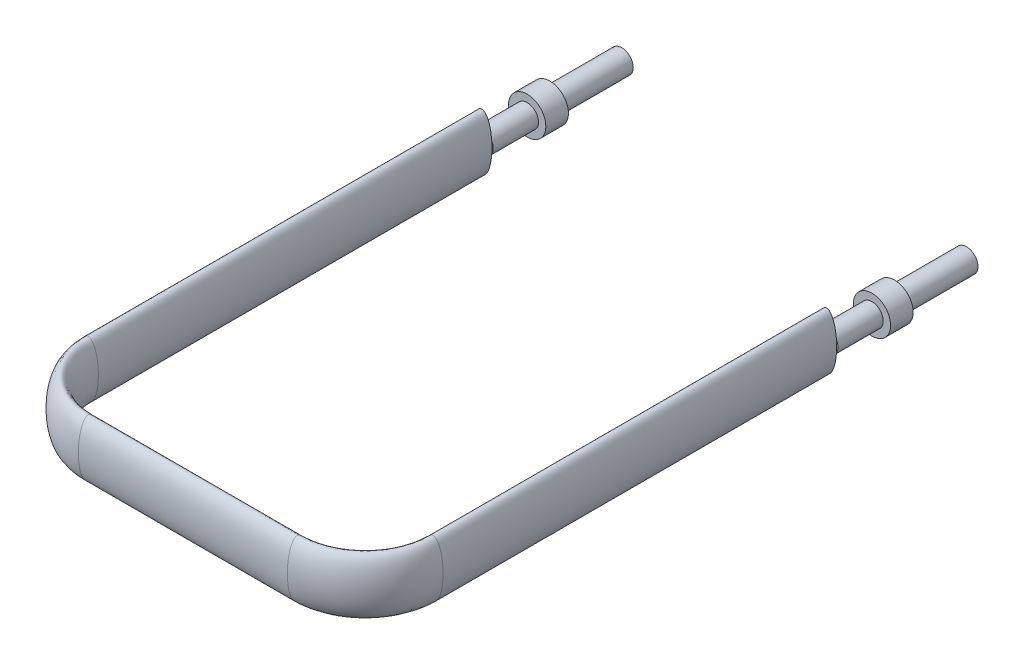
ISO-10303-21;
HEADER;
FILE_DESCRIPTION(('STEP AP214'),'2;1');
FILE_NAME('part.step','',(''),(''),'','','');
FILE_SCHEMA(('AUTOMOTIVE_DESIGN { 1 0 10303 214 1 1 1 1 }'));
ENDSEC;
DATA;
#1=APPLICATION_CONTEXT('core data for automotive mechanical design processes');
#2=APPLICATION_PROTOCOL_DEFINITION('international standard','automotive_design',2000,#1);
#3=PRODUCT_CONTEXT('',#1,'mechanical');
#4=PRODUCT('Part','Part','',(#3));
#5=PRODUCT_RELATED_PRODUCT_CATEGORY('part','',(#4));
#6=PRODUCT_DEFINITION_FORMATION('','',#4);
#7=PRODUCT_DEFINITION_CONTEXT('part definition',#1,'design');
#8=PRODUCT_DEFINITION('design','',#6,#7);
#9=PRODUCT_DEFINITION_SHAPE('','',#8);
#10=(LENGTH_UNIT() NAMED_UNIT(*) SI_UNIT(.MILLI.,.METRE.));
#11=(NAMED_UNIT(*) PLANE_ANGLE_UNIT() SI_UNIT($,.RADIAN.));
#12=(NAMED_UNIT(*) SI_UNIT($,.STERADIAN.) SOLID_ANGLE_UNIT());
#13=UNCERTAINTY_MEASURE_WITH_UNIT(LENGTH_MEASURE(1.E-05),#10,'distance_accuracy_value','');
#14=(GEOMETRIC_REPRESENTATION_CONTEXT(3) GLOBAL_UNCERTAINTY_ASSIGNED_CONTEXT((#13)) GLOBAL_UNIT_ASSIGNED_CONTEXT((#10,
#11,#12)) REPRESENTATION_CONTEXT('',''));
#15=CARTESIAN_POINT('',(0.,0.,0.));
#16=DIRECTION('',(0.,0.,1.));
#17=DIRECTION('',(1.,0.,0.));
#18=AXIS2_PLACEMENT_3D('',#15,#16,#17);
#19=CARTESIAN_POINT('',(7.62,0.,3.));
#20=DIRECTION('',(0.,0.,-1.));
#21=DIRECTION('',(-1.,0.,0.));
#22=AXIS2_PLACEMENT_3D('',#19,#20,#21);
#23=PLANE('',#22);
#24=CARTESIAN_POINT('',(7.62,0.,3.));
#25=DIRECTION('',(0.,0.,-1.));
#26=DIRECTION('',(0.,-1.,0.));
#27=AXIS2_PLACEMENT_3D('',#24,#25,#26);
#28=ELLIPSE('',#27,1.25,0.444386005475076);
#29=CARTESIAN_POINT('',(7.18424703488866,0.245192482341267,3.));
#30=VERTEX_POINT('',#29);
#31=CARTESIAN_POINT('',(8.05575296511134,0.245192482341266,3.));
#32=VERTEX_POINT('',#31);
#33=EDGE_CURVE('E98',#30,#32,#28,.T.);
#34=ORIENTED_EDGE('',*,*,#33,.T.);
#35=CARTESIAN_POINT('',(7.62,0.,3.));
#36=DIRECTION('',(0.,0.,1.));
#37=DIRECTION('',(1.,0.,0.));
#38=AXIS2_PLACEMENT_3D('',#35,#36,#37);
#39=CIRCLE('',#38,0.500000000000001);
#40=EDGE_CURVE('E44',#32,#30,#39,.T.);
#41=ORIENTED_EDGE('',*,*,#40,.T.);
#42=EDGE_LOOP('',(#34,#41));
#43=FACE_BOUND('',#42,.T.);
#44=ADVANCED_FACE('F33',(#43),#23,.T.);
#45=CARTESIAN_POINT('',(-7.62,0.,3.));
#46=DIRECTION('',(0.,0.,1.));
#47=DIRECTION('',(1.,0.,0.));
#48=AXIS2_PLACEMENT_3D('',#45,#46,#47);
#49=PLANE('',#48);
#50=CARTESIAN_POINT('',(-7.62,0.,3.));
#51=DIRECTION('',(0.,0.,1.));
#52=DIRECTION('',(0.,-1.,0.));
#53=AXIS2_PLACEMENT_3D('',#50,#51,#52);
#54=ELLIPSE('',#53,1.25,0.444386005475076);
#55=CARTESIAN_POINT('',(-7.18424703488865,-0.245192482341264,3.));
#56=VERTEX_POINT('',#55);
#57=CARTESIAN_POINT('',(-7.18424703488865,0.245192482341263,3.));
#58=VERTEX_POINT('',#57);
#59=EDGE_CURVE('E42',#56,#58,#54,.T.);
#60=ORIENTED_EDGE('',*,*,#59,.F.);
#61=CARTESIAN_POINT('',(-7.62,0.,3.));
#62=DIRECTION('',(0.,0.,1.));
#63=DIRECTION('',(1.,0.,0.));
#64=AXIS2_PLACEMENT_3D('',#61,#62,#63);
#65=CIRCLE('',#64,0.5);
#66=EDGE_CURVE('E124',#56,#58,#65,.T.);
#67=ORIENTED_EDGE('',*,*,#66,.T.);
#68=EDGE_LOOP('',(#60,#67));
#69=FACE_BOUND('',#68,.T.);
#70=ADVANCED_FACE('F151',(#69),#49,.T.);
#71=CARTESIAN_POINT('',(-7.62,0.,-3.18));
#72=DIRECTION('',(0.,0.,1.));
#73=DIRECTION('',(1.,0.,0.));
#74=AXIS2_PLACEMENT_3D('',#71,#72,#73);
#75=CYLINDRICAL_SURFACE('',#74,0.51);
#76=CARTESIAN_POINT('',(-7.62,0.,-3.18));
#77=DIRECTION('',(0.,0.,1.));
#78=DIRECTION('',(1.,0.,0.));
#79=AXIS2_PLACEMENT_3D('',#76,#77,#78);
#80=CIRCLE('',#79,0.51);
#81=CARTESIAN_POINT('',(-7.11,0.,-3.18));
#82=VERTEX_POINT('',#81);
#83=EDGE_CURVE('E135',#82,#82,#80,.T.);
#84=ORIENTED_EDGE('',*,*,#83,.T.);
#85=EDGE_LOOP('',(#84));
#86=FACE_BOUND('',#85,.T.);
#87=CARTESIAN_POINT('',(-7.62,0.,0.));
#88=DIRECTION('',(0.,0.,1.));
#89=DIRECTION('',(1.,0.,0.));
#90=AXIS2_PLACEMENT_3D('',#87,#88,#89);
#91=CIRCLE('',#90,0.51);
#92=CARTESIAN_POINT('',(-7.11,0.,0.));
#93=VERTEX_POINT('',#92);
#94=EDGE_CURVE('E37',#93,#93,#91,.T.);
#95=ORIENTED_EDGE('',*,*,#94,.F.);
#96=EDGE_LOOP('',(#95));
#97=FACE_BOUND('',#96,.T.);
#98=ADVANCED_FACE('F35',(#86,#97),#75,.T.);
#99=CARTESIAN_POINT('',(-7.62,0.,-3.18));
#100=DIRECTION('',(0.,0.,1.));
#101=DIRECTION('',(1.,0.,0.));
#102=AXIS2_PLACEMENT_3D('',#99,#100,#101);
#103=PLANE('',#102);
#104=ORIENTED_EDGE('',*,*,#83,.F.);
#105=EDGE_LOOP('',(#104));
#106=FACE_BOUND('',#105,.T.);
#107=ADVANCED_FACE('F150',(#106),#103,.F.);
#108=CARTESIAN_POINT('',(-7.62,0.,1.));
#109=DIRECTION('',(0.,0.,-1.));
#110=DIRECTION('',(-1.,0.,0.));
#111=AXIS2_PLACEMENT_3D('',#108,#109,#110);
#112=CYLINDRICAL_SURFACE('',#111,0.825);
#113=CARTESIAN_POINT('',(-7.62,0.,1.));
#114=DIRECTION('',(0.,0.,1.));
#115=DIRECTION('',(1.,0.,0.));
#116=AXIS2_PLACEMENT_3D('',#113,#114,#115);
#117=CIRCLE('',#116,0.825);
#118=CARTESIAN_POINT('',(-6.795,0.,1.));
#119=VERTEX_POINT('',#118);
#120=EDGE_CURVE('E136',#119,#119,#117,.T.);
#121=ORIENTED_EDGE('',*,*,#120,.F.);
#122=EDGE_LOOP('',(#121));
#123=FACE_BOUND('',#122,.T.);
#124=CARTESIAN_POINT('',(-7.62,0.,0.));
#125=DIRECTION('',(0.,0.,1.));
#126=DIRECTION('',(1.,0.,0.));
#127=AXIS2_PLACEMENT_3D('',#124,#125,#126);
#128=CIRCLE('',#127,0.825);
#129=CARTESIAN_POINT('',(-6.795,0.,0.));
#130=VERTEX_POINT('',#129);
#131=EDGE_CURVE('E130',#130,#130,#128,.T.);
#132=ORIENTED_EDGE('',*,*,#131,.T.);
#133=EDGE_LOOP('',(#132));
#134=FACE_BOUND('',#133,.T.);
#135=ADVANCED_FACE('F156',(#123,#134),#112,.T.);
#136=CARTESIAN_POINT('',(-7.62,0.,1.));
#137=DIRECTION('',(0.,0.,1.));
#138=DIRECTION('',(1.,0.,0.));
#139=AXIS2_PLACEMENT_3D('',#136,#137,#138);
#140=PLANE('',#139);
#141=CARTESIAN_POINT('',(-7.62,0.,1.));
#142=DIRECTION('',(0.,0.,1.));
#143=DIRECTION('',(1.,0.,0.));
#144=AXIS2_PLACEMENT_3D('',#141,#142,#143);
#145=CIRCLE('',#144,0.5);
#146=CARTESIAN_POINT('',(-7.12,0.,1.));
#147=VERTEX_POINT('',#146);
#148=EDGE_CURVE('E132',#147,#147,#145,.T.);
#149=ORIENTED_EDGE('',*,*,#148,.F.);
#150=EDGE_LOOP('',(#149));
#151=FACE_BOUND('',#150,.T.);
#152=ORIENTED_EDGE('',*,*,#120,.T.);
#153=EDGE_LOOP('',(#152));
#154=FACE_BOUND('',#153,.T.);
#155=ADVANCED_FACE('F285',(#151,#154),#140,.T.);
#156=CARTESIAN_POINT('',(-7.62,0.,0.));
#157=DIRECTION('',(0.,0.,1.));
#158=DIRECTION('',(1.,0.,0.));
#159=AXIS2_PLACEMENT_3D('',#156,#157,#158);
#160=PLANE('',#159);
#161=ORIENTED_EDGE('',*,*,#94,.T.);
#162=EDGE_LOOP('',(#161));
#163=FACE_BOUND('',#162,.T.);
#164=ORIENTED_EDGE('',*,*,#131,.F.);
#165=EDGE_LOOP('',(#164));
#166=FACE_BOUND('',#165,.T.);
#167=ADVANCED_FACE('F146',(#163,#166),#160,.F.);
#168=CARTESIAN_POINT('',(-7.62,0.,3.));
#169=DIRECTION('',(0.,0.,-1.));
#170=DIRECTION('',(-1.,0.,0.));
#171=AXIS2_PLACEMENT_3D('',#168,#169,#170);
#172=CYLINDRICAL_SURFACE('',#171,0.5);
#173=CARTESIAN_POINT('',(-8.05575296511134,0.245192482341263,3.));
#174=VERTEX_POINT('',#173);
#175=EDGE_CURVE('E127',#58,#174,#65,.T.);
#176=ORIENTED_EDGE('',*,*,#175,.F.);
#177=ORIENTED_EDGE('',*,*,#66,.F.);
#178=CARTESIAN_POINT('',(-8.05575296511134,-0.245192482341264,3.));
#179=VERTEX_POINT('',#178);
#180=EDGE_CURVE('E280',#179,#56,#65,.T.);
#181=ORIENTED_EDGE('',*,*,#180,.F.);
#182=EDGE_CURVE('E131',#174,#179,#65,.T.);
#183=ORIENTED_EDGE('',*,*,#182,.F.);
#184=EDGE_LOOP('',(#176,#177,#181,#183));
#185=FACE_BOUND('',#184,.T.);
#186=ORIENTED_EDGE('',*,*,#148,.T.);
#187=EDGE_LOOP('',(#186));
#188=FACE_BOUND('',#187,.T.);
#189=ADVANCED_FACE('F266',(#185,#188),#172,.T.);
#190=EDGE_CURVE('E126',#174,#179,#54,.T.);
#191=ORIENTED_EDGE('',*,*,#190,.F.);
#192=ORIENTED_EDGE('',*,*,#182,.T.);
#193=EDGE_LOOP('',(#191,#192));
#194=FACE_BOUND('',#193,.T.);
#195=ADVANCED_FACE('F159',(#194),#49,.T.);
#196=CARTESIAN_POINT('',(-7.62,0.,3.));
#197=DIRECTION('',(0.,0.,1.));
#198=DIRECTION('',(1.,0.,0.));
#199=AXIS2_PLACEMENT_3D('',#196,#197,#198);
#200=PLANE('',#199);
#201=EDGE_CURVE('E125',#58,#174,#54,.T.);
#202=ORIENTED_EDGE('',*,*,#201,.F.);
#203=ORIENTED_EDGE('',*,*,#175,.T.);
#204=EDGE_LOOP('',(#202,#203));
#205=FACE_BOUND('',#204,.T.);
#206=ADVANCED_FACE('F177',(#205),#200,.F.);
#207=CARTESIAN_POINT('',(-7.62,-1.25,3.));
#208=VERTEX_POINT('',#207);
#209=EDGE_CURVE('E120',#179,#208,#54,.T.);
#210=ORIENTED_EDGE('',*,*,#209,.F.);
#211=ORIENTED_EDGE('',*,*,#180,.T.);
#212=EDGE_CURVE('E121',#208,#56,#54,.T.);
#213=ORIENTED_EDGE('',*,*,#212,.F.);
#214=EDGE_LOOP('',(#210,#211,#213));
#215=FACE_BOUND('',#214,.T.);
#216=ADVANCED_FACE('F167',(#215),#200,.F.);
#217=CARTESIAN_POINT('',(7.62,-1.25,3.));
#218=VERTEX_POINT('',#217);
#219=CARTESIAN_POINT('',(7.18424703488866,-0.245192482341267,3.));
#220=VERTEX_POINT('',#219);
#221=EDGE_CURVE('E102',#218,#220,#28,.T.);
#222=ORIENTED_EDGE('',*,*,#221,.T.);
#223=CARTESIAN_POINT('',(8.05575296511134,-0.245192482341266,3.));
#224=VERTEX_POINT('',#223);
#225=EDGE_CURVE('E11',#220,#224,#39,.T.);
#226=ORIENTED_EDGE('',*,*,#225,.T.);
#227=EDGE_CURVE('E99',#224,#218,#28,.T.);
#228=ORIENTED_EDGE('',*,*,#227,.T.);
#229=EDGE_LOOP('',(#222,#226,#228));
#230=FACE_BOUND('',#229,.T.);
#231=ADVANCED_FACE('F162',(#230),#23,.T.);
#232=CARTESIAN_POINT('',(7.62,-1.25,3.));
#233=CARTESIAN_POINT('',(7.62,-1.25,20.4));
#234=CARTESIAN_POINT('',(6.73122798904985,-1.25,3.));
#235=CARTESIAN_POINT('',(6.73122798904985,-1.25,20.4));
#236=CARTESIAN_POINT('',(6.73122798904985,1.25,3.));
#237=CARTESIAN_POINT('',(6.73122798904985,1.25,20.4));
#238=CARTESIAN_POINT('',(7.62,1.25,3.));
#239=CARTESIAN_POINT('',(7.62,1.25,20.4));
#240=CARTESIAN_POINT('',(8.50877201095015,1.25,3.));
#241=CARTESIAN_POINT('',(8.50877201095015,1.25,20.4));
#242=CARTESIAN_POINT('',(8.50877201095015,-1.25,3.));
#243=CARTESIAN_POINT('',(8.50877201095015,-1.25,20.4));
#244=CARTESIAN_POINT('',(7.62,-1.25,3.));
#245=CARTESIAN_POINT('',(7.62,-1.25,20.4));
#246=(BOUNDED_SURFACE() B_SPLINE_SURFACE(3,1,((#232,#233),(#234,#235),(#236,#237),(#238,#239),
(#240,#241),(#242,#243),(#244,#245)),.UNSPECIFIED.,.T.,.F.,.F.) B_SPLINE_SURFACE_WITH_KNOTS((4,
3,4),(2,2),(0.,0.5,1.),(0.,1.),
.UNSPECIFIED.) GEOMETRIC_REPRESENTATION_ITEM() RATIONAL_B_SPLINE_SURFACE(((1.,1.),
(0.333333333333333,0.333333333333333),(0.333333333333333,0.333333333333333),(1.,1.),
(0.333333333333333,0.333333333333333),(0.333333333333333,0.333333333333333),(1.,1.))) REPRESENTATION_ITEM('') SURFACE());
#247=CARTESIAN_POINT('',(7.62,0.,20.4));
#248=DIRECTION('',(0.,0.,-1.));
#249=DIRECTION('',(0.,-1.,0.));
#250=AXIS2_PLACEMENT_3D('',#247,#248,#249);
#251=ELLIPSE('',#250,1.25,0.444386005475076);
#252=CARTESIAN_POINT('',(7.62,-1.25,20.4));
#253=VERTEX_POINT('',#252);
#254=EDGE_CURVE('E106',#253,#253,#251,.T.);
#255=EDGE_CURVE('E83',#32,#224,#28,.T.);
#256=EDGE_CURVE('E101',#220,#30,#28,.T.);
#257=ORIENTED_EDGE('',*,*,#254,.T.);
#258=EDGE_LOOP('',(#257));
#259=FACE_BOUND('',#258,.T.);
#260=ORIENTED_EDGE('',*,*,#221,.F.);
#261=ORIENTED_EDGE('',*,*,#227,.F.);
#262=ORIENTED_EDGE('',*,*,#255,.F.);
#263=ORIENTED_EDGE('',*,*,#33,.F.);
#264=ORIENTED_EDGE('',*,*,#256,.F.);
#265=EDGE_LOOP('',(#260,#261,#262,#263,#264));
#266=FACE_BOUND('',#265,.T.);
#267=ADVANCED_FACE('F96',(#259,#266),#246,.F.);
#268=CARTESIAN_POINT('',(7.62,-1.25,20.4));
#269=CARTESIAN_POINT('',(7.62000000000001,-1.25,22.1573593128807));
#270=CARTESIAN_POINT('',(6.37735931288072,-1.25,23.4));
#271=CARTESIAN_POINT('',(4.61999999999999,-1.25,23.4));
#272=CARTESIAN_POINT('',(6.73122798904985,-1.25,20.4));
#273=CARTESIAN_POINT('',(6.73122798904986,-1.25,21.6367287227237));
#274=CARTESIAN_POINT('',(5.85672872272373,-1.25,22.5112279890498));
#275=CARTESIAN_POINT('',(4.61999999999999,-1.25,22.5112279890498));
#276=CARTESIAN_POINT('',(6.73122798904985,1.25,20.4));
#277=CARTESIAN_POINT('',(6.73122798904986,1.25,21.6367287227237));
#278=CARTESIAN_POINT('',(5.85672872272373,1.25,22.5112279890498));
#279=CARTESIAN_POINT('',(4.61999999999999,1.25,22.5112279890498));
#280=CARTESIAN_POINT('',(7.62,1.25,20.4));
#281=CARTESIAN_POINT('',(7.62000000000001,1.25,22.1573593128807));
#282=CARTESIAN_POINT('',(6.37735931288072,1.25,23.4));
#283=CARTESIAN_POINT('',(4.61999999999999,1.25,23.4));
#284=CARTESIAN_POINT('',(8.50877201095015,1.25,20.4));
#285=CARTESIAN_POINT('',(8.50877201095017,1.25,22.6779899030377));
#286=CARTESIAN_POINT('',(6.89798990303771,1.25,24.2887720109502));
#287=CARTESIAN_POINT('',(4.61999999999998,1.25,24.2887720109501));
#288=CARTESIAN_POINT('',(8.50877201095015,-1.25,20.4));
#289=CARTESIAN_POINT('',(8.50877201095017,-1.25,22.6779899030377));
#290=CARTESIAN_POINT('',(6.89798990303771,-1.25,24.2887720109502));
#291=CARTESIAN_POINT('',(4.61999999999998,-1.25,24.2887720109501));
#292=CARTESIAN_POINT('',(7.62,-1.25,20.4));
#293=CARTESIAN_POINT('',(7.62000000000001,-1.25,22.1573593128807));
#294=CARTESIAN_POINT('',(6.37735931288072,-1.25,23.4));
#295=CARTESIAN_POINT('',(4.61999999999999,-1.25,23.4));
#296=(BOUNDED_SURFACE() B_SPLINE_SURFACE(3,3,((#268,#269,#270,#271),(#272,#273,#274,#275),(#276,
#277,#278,#279),(#280,#281,#282,#283),(#284,#285,#286,#287),(#288,#289,#290,#291),(#292,#293,
#294,#295)),.UNSPECIFIED.,.T.,.F.,.F.) B_SPLINE_SURFACE_WITH_KNOTS((4,3,4),(4,4),(0.,0.5,1.),
(0.,1.),.UNSPECIFIED.) GEOMETRIC_REPRESENTATION_ITEM() RATIONAL_B_SPLINE_SURFACE(((1.,
0.804737854124362,0.804737854124362,1.),(0.333333333333333,0.268245951374787,0.268245951374787,
0.333333333333333),(0.333333333333333,0.268245951374787,0.268245951374787,0.333333333333333),
(1.,0.804737854124362,0.804737854124362,1.),(0.333333333333333,0.268245951374787,
0.268245951374787,0.333333333333333),(0.333333333333333,0.268245951374787,0.268245951374787,
0.333333333333333),(1.,0.804737854124362,0.804737854124362,1.))) REPRESENTATION_ITEM('') SURFACE());
#297=CARTESIAN_POINT('',(4.62,0.,23.4));
#298=DIRECTION('',(1.,0.,0.));
#299=DIRECTION('',(0.,-1.,0.));
#300=AXIS2_PLACEMENT_3D('',#297,#298,#299);
#301=ELLIPSE('',#300,1.25,0.444386005475076);
#302=CARTESIAN_POINT('',(4.62,-1.25,23.4));
#303=VERTEX_POINT('',#302);
#304=EDGE_CURVE('E111',#303,#303,#301,.T.);
#305=ORIENTED_EDGE('',*,*,#304,.T.);
#306=EDGE_LOOP('',(#305));
#307=FACE_BOUND('',#306,.T.);
#308=ORIENTED_EDGE('',*,*,#254,.F.);
#309=EDGE_LOOP('',(#308));
#310=FACE_BOUND('',#309,.T.);
#311=ADVANCED_FACE('F174',(#307,#310),#296,.F.);
#312=CARTESIAN_POINT('',(4.61999999999998,-1.25,23.4));
#313=CARTESIAN_POINT('',(-4.61999999999997,-1.25,23.4));
#314=CARTESIAN_POINT('',(4.61999999999998,-1.25,22.5112279890498));
#315=CARTESIAN_POINT('',(-4.61999999999997,-1.25,22.5112279890498));
#316=CARTESIAN_POINT('',(4.61999999999998,1.25,22.5112279890498));
#317=CARTESIAN_POINT('',(-4.61999999999997,1.25,22.5112279890498));
#318=CARTESIAN_POINT('',(4.61999999999998,1.25,23.4));
#319=CARTESIAN_POINT('',(-4.61999999999997,1.25,23.4));
#320=CARTESIAN_POINT('',(4.61999999999998,1.25,24.2887720109501));
#321=CARTESIAN_POINT('',(-4.61999999999997,1.25,24.2887720109502));
#322=CARTESIAN_POINT('',(4.61999999999998,-1.25,24.2887720109501));
#323=CARTESIAN_POINT('',(-4.61999999999997,-1.25,24.2887720109502));
#324=CARTESIAN_POINT('',(4.61999999999998,-1.25,23.4));
#325=CARTESIAN_POINT('',(-4.61999999999997,-1.25,23.4));
#326=(BOUNDED_SURFACE() B_SPLINE_SURFACE(3,1,((#312,#313),(#314,#315),(#316,#317),(#318,#319),
(#320,#321),(#322,#323),(#324,#325)),.UNSPECIFIED.,.T.,.F.,.F.) B_SPLINE_SURFACE_WITH_KNOTS((4,
3,4),(2,2),(0.,0.5,1.),(0.,1.),
.UNSPECIFIED.) GEOMETRIC_REPRESENTATION_ITEM() RATIONAL_B_SPLINE_SURFACE(((1.,1.),
(0.333333333333333,0.333333333333333),(0.333333333333333,0.333333333333333),(1.,1.),
(0.333333333333333,0.333333333333333),(0.333333333333333,0.333333333333333),(1.,1.))) REPRESENTATION_ITEM('') SURFACE());
#327=CARTESIAN_POINT('',(-4.61999999999997,0.,23.4));
#328=DIRECTION('',(1.,0.,0.));
#329=DIRECTION('',(0.,-1.,0.));
#330=AXIS2_PLACEMENT_3D('',#327,#328,#329);
#331=ELLIPSE('',#330,1.25,0.444386005475076);
#332=CARTESIAN_POINT('',(-4.61999999999997,-1.25,23.4));
#333=VERTEX_POINT('',#332);
#334=EDGE_CURVE('E114',#333,#333,#331,.T.);
#335=ORIENTED_EDGE('',*,*,#334,.T.);
#336=EDGE_LOOP('',(#335));
#337=FACE_BOUND('',#336,.T.);
#338=ORIENTED_EDGE('',*,*,#304,.F.);
#339=EDGE_LOOP('',(#338));
#340=FACE_BOUND('',#339,.T.);
#341=ADVANCED_FACE('F228',(#337,#340),#326,.F.);
#342=CARTESIAN_POINT('',(-4.61999999999997,-1.25,23.4));
#343=CARTESIAN_POINT('',(-6.37735931288071,-1.25,23.4));
#344=CARTESIAN_POINT('',(-7.62000000000001,-1.25,22.1573593128807));
#345=CARTESIAN_POINT('',(-7.62,-1.25,20.4));
#346=CARTESIAN_POINT('',(-4.61999999999998,-1.25,22.5112279890498));
#347=CARTESIAN_POINT('',(-5.85672872272372,-1.25,22.5112279890499));
#348=CARTESIAN_POINT('',(-6.73122798904985,-1.25,21.6367287227237));
#349=CARTESIAN_POINT('',(-6.73122798904985,-1.25,20.4));
#350=CARTESIAN_POINT('',(-4.61999999999998,1.25,22.5112279890498));
#351=CARTESIAN_POINT('',(-5.85672872272372,1.25,22.5112279890499));
#352=CARTESIAN_POINT('',(-6.73122798904985,1.25,21.6367287227237));
#353=CARTESIAN_POINT('',(-6.73122798904985,1.25,20.4));
#354=CARTESIAN_POINT('',(-4.61999999999997,1.25,23.4));
#355=CARTESIAN_POINT('',(-6.37735931288071,1.25,23.4));
#356=CARTESIAN_POINT('',(-7.62000000000001,1.25,22.1573593128807));
#357=CARTESIAN_POINT('',(-7.62,1.25,20.4));
#358=CARTESIAN_POINT('',(-4.61999999999997,1.25,24.2887720109502));
#359=CARTESIAN_POINT('',(-6.8979899030377,1.25,24.2887720109502));
#360=CARTESIAN_POINT('',(-8.50877201095016,1.25,22.6779899030377));
#361=CARTESIAN_POINT('',(-8.50877201095014,1.25,20.4));
#362=CARTESIAN_POINT('',(-4.61999999999997,-1.25,24.2887720109502));
#363=CARTESIAN_POINT('',(-6.8979899030377,-1.25,24.2887720109502));
#364=CARTESIAN_POINT('',(-8.50877201095016,-1.25,22.6779899030377));
#365=CARTESIAN_POINT('',(-8.50877201095014,-1.25,20.4));
#366=CARTESIAN_POINT('',(-4.61999999999997,-1.25,23.4));
#367=CARTESIAN_POINT('',(-6.37735931288071,-1.25,23.4));
#368=CARTESIAN_POINT('',(-7.62000000000001,-1.25,22.1573593128807));
#369=CARTESIAN_POINT('',(-7.62,-1.25,20.4));
#370=(BOUNDED_SURFACE() B_SPLINE_SURFACE(3,3,((#342,#343,#344,#345),(#346,#347,#348,#349),(#350,
#351,#352,#353),(#354,#355,#356,#357),(#358,#359,#360,#361),(#362,#363,#364,#365),(#366,#367,
#368,#369)),.UNSPECIFIED.,.T.,.F.,.F.) B_SPLINE_SURFACE_WITH_KNOTS((4,3,4),(4,4),(0.,0.5,1.),
(0.,1.),.UNSPECIFIED.) GEOMETRIC_REPRESENTATION_ITEM() RATIONAL_B_SPLINE_SURFACE(((1.,
0.804737854124362,0.804737854124362,1.),(0.333333333333333,0.268245951374787,0.268245951374787,
0.333333333333333),(0.333333333333333,0.268245951374787,0.268245951374787,0.333333333333333),
(1.,0.804737854124362,0.804737854124362,1.),(0.333333333333333,0.268245951374787,
0.268245951374787,0.333333333333333),(0.333333333333333,0.268245951374787,0.268245951374787,
0.333333333333333),(1.,0.804737854124362,0.804737854124362,1.))) REPRESENTATION_ITEM('') SURFACE());
#371=CARTESIAN_POINT('',(-7.61999999999998,0.,20.4));
#372=DIRECTION('',(0.,0.,1.));
#373=DIRECTION('',(0.,-1.,0.));
#374=AXIS2_PLACEMENT_3D('',#371,#372,#373);
#375=ELLIPSE('',#374,1.25,0.444386005475076);
#376=CARTESIAN_POINT('',(-7.61999999999998,-1.25,20.4));
#377=VERTEX_POINT('',#376);
#378=EDGE_CURVE('E117',#377,#377,#375,.T.);
#379=ORIENTED_EDGE('',*,*,#378,.T.);
#380=EDGE_LOOP('',(#379));
#381=FACE_BOUND('',#380,.T.);
#382=ORIENTED_EDGE('',*,*,#334,.F.);
#383=EDGE_LOOP('',(#382));
#384=FACE_BOUND('',#383,.T.);
#385=ADVANCED_FACE('F191',(#381,#384),#370,.F.);
#386=CARTESIAN_POINT('',(-7.62,-1.25,20.4));
#387=CARTESIAN_POINT('',(-7.62,-1.25,3.));
#388=CARTESIAN_POINT('',(-6.73122798904985,-1.25,20.4));
#389=CARTESIAN_POINT('',(-6.73122798904985,-1.25,3.));
#390=CARTESIAN_POINT('',(-6.73122798904985,1.25,20.4));
#391=CARTESIAN_POINT('',(-6.73122798904985,1.25,3.));
#392=CARTESIAN_POINT('',(-7.62,1.25,20.4));
#393=CARTESIAN_POINT('',(-7.62,1.25,3.));
#394=CARTESIAN_POINT('',(-8.50877201095015,1.25,20.4));
#395=CARTESIAN_POINT('',(-8.50877201095015,1.25,3.));
#396=CARTESIAN_POINT('',(-8.50877201095015,-1.25,20.4));
#397=CARTESIAN_POINT('',(-8.50877201095015,-1.25,3.));
#398=CARTESIAN_POINT('',(-7.62,-1.25,20.4));
#399=CARTESIAN_POINT('',(-7.62,-1.25,3.));
#400=(BOUNDED_SURFACE() B_SPLINE_SURFACE(3,1,((#386,#387),(#388,#389),(#390,#391),(#392,#393),
(#394,#395),(#396,#397),(#398,#399)),.UNSPECIFIED.,.T.,.F.,.F.) B_SPLINE_SURFACE_WITH_KNOTS((4,
3,4),(2,2),(0.,0.5,1.),(0.,1.),
.UNSPECIFIED.) GEOMETRIC_REPRESENTATION_ITEM() RATIONAL_B_SPLINE_SURFACE(((1.,1.),
(0.333333333333333,0.333333333333333),(0.333333333333333,0.333333333333333),(1.,1.),
(0.333333333333333,0.333333333333333),(0.333333333333333,0.333333333333333),(1.,1.))) REPRESENTATION_ITEM('') SURFACE());
#401=ORIENTED_EDGE('',*,*,#212,.T.);
#402=ORIENTED_EDGE('',*,*,#59,.T.);
#403=ORIENTED_EDGE('',*,*,#201,.T.);
#404=ORIENTED_EDGE('',*,*,#190,.T.);
#405=ORIENTED_EDGE('',*,*,#209,.T.);
#406=EDGE_LOOP('',(#401,#402,#403,#404,#405));
#407=FACE_BOUND('',#406,.T.);
#408=ORIENTED_EDGE('',*,*,#378,.F.);
#409=EDGE_LOOP('',(#408));
#410=FACE_BOUND('',#409,.T.);
#411=ADVANCED_FACE('F179',(#407,#410),#400,.F.);
#412=CARTESIAN_POINT('',(7.62,0.,3.));
#413=DIRECTION('',(0.,0.,1.));
#414=DIRECTION('',(1.,0.,0.));
#415=AXIS2_PLACEMENT_3D('',#412,#413,#414);
#416=PLANE('',#415);
#417=EDGE_CURVE('E45',#30,#220,#39,.T.);
#418=ORIENTED_EDGE('',*,*,#417,.T.);
#419=ORIENTED_EDGE('',*,*,#256,.T.);
#420=EDGE_LOOP('',(#418,#419));
#421=FACE_BOUND('',#420,.T.);
#422=ADVANCED_FACE('F169',(#421),#416,.T.);
#423=CARTESIAN_POINT('',(7.62,0.,-3.18));
#424=DIRECTION('',(0.,0.,1.));
#425=DIRECTION('',(1.,0.,0.));
#426=AXIS2_PLACEMENT_3D('',#423,#424,#425);
#427=CYLINDRICAL_SURFACE('',#426,0.510000000000001);
#428=CARTESIAN_POINT('',(7.62,0.,-3.18));
#429=DIRECTION('',(0.,0.,1.));
#430=DIRECTION('',(1.,0.,0.));
#431=AXIS2_PLACEMENT_3D('',#428,#429,#430);
#432=CIRCLE('',#431,0.510000000000001);
#433=CARTESIAN_POINT('',(8.13,0.,-3.18));
#434=VERTEX_POINT('',#433);
#435=EDGE_CURVE('E442',#434,#434,#432,.T.);
#436=ORIENTED_EDGE('',*,*,#435,.T.);
#437=EDGE_LOOP('',(#436));
#438=FACE_BOUND('',#437,.T.);
#439=CARTESIAN_POINT('',(7.62,0.,0.));
#440=DIRECTION('',(0.,0.,1.));
#441=DIRECTION('',(1.,0.,0.));
#442=AXIS2_PLACEMENT_3D('',#439,#440,#441);
#443=CIRCLE('',#442,0.510000000000001);
#444=CARTESIAN_POINT('',(8.13,0.,0.));
#445=VERTEX_POINT('',#444);
#446=EDGE_CURVE('E107',#445,#445,#443,.T.);
#447=ORIENTED_EDGE('',*,*,#446,.F.);
#448=EDGE_LOOP('',(#447));
#449=FACE_BOUND('',#448,.T.);
#450=ADVANCED_FACE('F181',(#438,#449),#427,.T.);
#451=CARTESIAN_POINT('',(7.62,0.,-3.18));
#452=DIRECTION('',(0.,0.,1.));
#453=DIRECTION('',(1.,0.,0.));
#454=AXIS2_PLACEMENT_3D('',#451,#452,#453);
#455=PLANE('',#454);
#456=ORIENTED_EDGE('',*,*,#435,.F.);
#457=EDGE_LOOP('',(#456));
#458=FACE_BOUND('',#457,.T.);
#459=ADVANCED_FACE('F188',(#458),#455,.F.);
#460=CARTESIAN_POINT('',(7.62,0.,1.));
#461=DIRECTION('',(0.,0.,-1.));
#462=DIRECTION('',(-1.,0.,0.));
#463=AXIS2_PLACEMENT_3D('',#460,#461,#462);
#464=CYLINDRICAL_SURFACE('',#463,0.824999999999999);
#465=CARTESIAN_POINT('',(7.62,0.,1.));
#466=DIRECTION('',(0.,0.,1.));
#467=DIRECTION('',(1.,0.,0.));
#468=AXIS2_PLACEMENT_3D('',#465,#466,#467);
#469=CIRCLE('',#468,0.824999999999999);
#470=CARTESIAN_POINT('',(8.445,0.,1.));
#471=VERTEX_POINT('',#470);
#472=EDGE_CURVE('E447',#471,#471,#469,.T.);
#473=ORIENTED_EDGE('',*,*,#472,.F.);
#474=EDGE_LOOP('',(#473));
#475=FACE_BOUND('',#474,.T.);
#476=CARTESIAN_POINT('',(7.62,0.,0.));
#477=DIRECTION('',(0.,0.,1.));
#478=DIRECTION('',(1.,0.,0.));
#479=AXIS2_PLACEMENT_3D('',#476,#477,#478);
#480=CIRCLE('',#479,0.824999999999999);
#481=CARTESIAN_POINT('',(8.445,0.,0.));
#482=VERTEX_POINT('',#481);
#483=EDGE_CURVE('E92',#482,#482,#480,.T.);
#484=ORIENTED_EDGE('',*,*,#483,.T.);
#485=EDGE_LOOP('',(#484));
#486=FACE_BOUND('',#485,.T.);
#487=ADVANCED_FACE('F208',(#475,#486),#464,.T.);
#488=CARTESIAN_POINT('',(7.62,0.,1.));
#489=DIRECTION('',(0.,0.,1.));
#490=DIRECTION('',(1.,0.,0.));
#491=AXIS2_PLACEMENT_3D('',#488,#489,#490);
#492=PLANE('',#491);
#493=CARTESIAN_POINT('',(7.62,0.,1.));
#494=DIRECTION('',(0.,0.,1.));
#495=DIRECTION('',(1.,0.,0.));
#496=AXIS2_PLACEMENT_3D('',#493,#494,#495);
#497=CIRCLE('',#496,0.500000000000001);
#498=CARTESIAN_POINT('',(8.12,0.,1.));
#499=VERTEX_POINT('',#498);
#500=EDGE_CURVE('E443',#499,#499,#497,.T.);
#501=ORIENTED_EDGE('',*,*,#500,.F.);
#502=EDGE_LOOP('',(#501));
#503=FACE_BOUND('',#502,.T.);
#504=ORIENTED_EDGE('',*,*,#472,.T.);
#505=EDGE_LOOP('',(#504));
#506=FACE_BOUND('',#505,.T.);
#507=ADVANCED_FACE('F203',(#503,#506),#492,.T.);
#508=CARTESIAN_POINT('',(7.62,0.,0.));
#509=DIRECTION('',(0.,0.,1.));
#510=DIRECTION('',(1.,0.,0.));
#511=AXIS2_PLACEMENT_3D('',#508,#509,#510);
#512=PLANE('',#511);
#513=ORIENTED_EDGE('',*,*,#446,.T.);
#514=EDGE_LOOP('',(#513));
#515=FACE_BOUND('',#514,.T.);
#516=ORIENTED_EDGE('',*,*,#483,.F.);
#517=EDGE_LOOP('',(#516));
#518=FACE_BOUND('',#517,.T.);
#519=ADVANCED_FACE('F199',(#515,#518),#512,.F.);
#520=CARTESIAN_POINT('',(7.62,0.,3.));
#521=DIRECTION('',(0.,0.,-1.));
#522=DIRECTION('',(-1.,0.,0.));
#523=AXIS2_PLACEMENT_3D('',#520,#521,#522);
#524=CYLINDRICAL_SURFACE('',#523,0.500000000000001);
#525=ORIENTED_EDGE('',*,*,#40,.F.);
#526=EDGE_CURVE('E52',#224,#32,#39,.T.);
#527=ORIENTED_EDGE('',*,*,#526,.F.);
#528=ORIENTED_EDGE('',*,*,#225,.F.);
#529=ORIENTED_EDGE('',*,*,#417,.F.);
#530=EDGE_LOOP('',(#525,#527,#528,#529));
#531=FACE_BOUND('',#530,.T.);
#532=ORIENTED_EDGE('',*,*,#500,.T.);
#533=EDGE_LOOP('',(#532));
#534=FACE_BOUND('',#533,.T.);
#535=ADVANCED_FACE('F86',(#531,#534),#524,.T.);
#536=ORIENTED_EDGE('',*,*,#526,.T.);
#537=ORIENTED_EDGE('',*,*,#255,.T.);
#538=EDGE_LOOP('',(#536,#537));
#539=FACE_BOUND('',#538,.T.);
#540=ADVANCED_FACE('F81',(#539),#416,.T.);
#541=CLOSED_SHELL('',(#44,#70,#98,#107,#135,#155,#167,#189,#195,#206,#216,#231,#267,#311,#341,
#385,#411,#422,#450,#459,#487,#507,#519,#535,#540));
#542=MANIFOLD_SOLID_BREP('B2',#541);
#543=ADVANCED_BREP_SHAPE_REPRESENTATION('',(#18,#542),#14);
#544=SHAPE_DEFINITION_REPRESENTATION(#9,#543);
ENDSEC;
END-ISO-10303-21;
